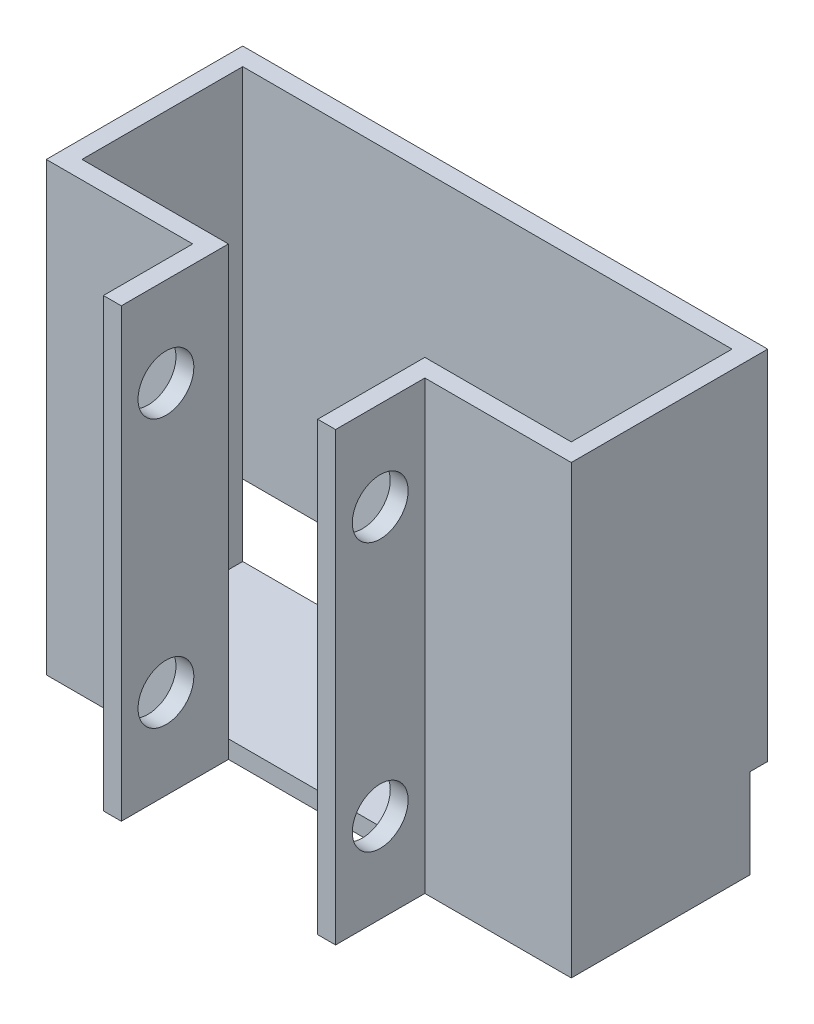
ISO-10303-21;
HEADER;
FILE_DESCRIPTION(('STEP AP214'),'2;1');
FILE_NAME('part.step','',(''),(''),'','','');
FILE_SCHEMA(('AUTOMOTIVE_DESIGN { 1 0 10303 214 1 1 1 1 }'));
ENDSEC;
DATA;
#1=APPLICATION_CONTEXT('core data for automotive mechanical design processes');
#2=APPLICATION_PROTOCOL_DEFINITION('international standard','automotive_design',2000,#1);
#3=PRODUCT_CONTEXT('',#1,'mechanical');
#4=PRODUCT('Part','Part','',(#3));
#5=PRODUCT_RELATED_PRODUCT_CATEGORY('part','',(#4));
#6=PRODUCT_DEFINITION_FORMATION('','',#4);
#7=PRODUCT_DEFINITION_CONTEXT('part definition',#1,'design');
#8=PRODUCT_DEFINITION('design','',#6,#7);
#9=PRODUCT_DEFINITION_SHAPE('','',#8);
#10=(LENGTH_UNIT() NAMED_UNIT(*) SI_UNIT(.MILLI.,.METRE.));
#11=(NAMED_UNIT(*) PLANE_ANGLE_UNIT() SI_UNIT($,.RADIAN.));
#12=(NAMED_UNIT(*) SI_UNIT($,.STERADIAN.) SOLID_ANGLE_UNIT());
#13=UNCERTAINTY_MEASURE_WITH_UNIT(LENGTH_MEASURE(1.E-05),#10,'distance_accuracy_value','');
#14=(GEOMETRIC_REPRESENTATION_CONTEXT(3) GLOBAL_UNCERTAINTY_ASSIGNED_CONTEXT((#13)) GLOBAL_UNIT_ASSIGNED_CONTEXT((#10,
#11,#12)) REPRESENTATION_CONTEXT('',''));
#15=CARTESIAN_POINT('',(0.,0.,0.));
#16=DIRECTION('',(0.,0.,1.));
#17=DIRECTION('',(1.,0.,0.));
#18=AXIS2_PLACEMENT_3D('',#15,#16,#17);
#19=CARTESIAN_POINT('',(0.,0.,27.94));
#20=DIRECTION('',(0.,0.,1.));
#21=DIRECTION('',(1.,0.,0.));
#22=AXIS2_PLACEMENT_3D('',#19,#20,#21);
#23=PLANE('',#22);
#24=DIRECTION('',(-1.,0.,0.));
#25=VECTOR('',#24,1.);
#26=CARTESIAN_POINT('',(-35.9935676045013,30.5475602803156,27.94));
#27=LINE('',#26,#25);
#28=CARTESIAN_POINT('',(38.6824323954987,30.5475602803156,27.94));
#29=VERTEX_POINT('',#28);
#30=CARTESIAN_POINT('',(17.8544323954987,30.5475602803156,27.94));
#31=VERTEX_POINT('',#30);
#32=EDGE_CURVE('E306',#29,#31,#27,.T.);
#33=ORIENTED_EDGE('',*,*,#32,.T.);
#34=DIRECTION('',(0.,1.,0.));
#35=VECTOR('',#34,1.);
#36=CARTESIAN_POINT('',(17.8544323954987,30.5475602803156,27.94));
#37=LINE('',#36,#35);
#38=CARTESIAN_POINT('',(17.8544323954987,-32.9524397196844,27.94));
#39=VERTEX_POINT('',#38);
#40=EDGE_CURVE('E196',#39,#31,#37,.T.);
#41=ORIENTED_EDGE('',*,*,#40,.F.);
#42=DIRECTION('',(1.,0.,0.));
#43=VECTOR('',#42,1.);
#44=CARTESIAN_POINT('',(-35.9935676045013,-32.9524397196844,27.94));
#45=LINE('',#44,#43);
#46=CARTESIAN_POINT('',(38.6824323954987,-32.9524397196844,27.94));
#47=VERTEX_POINT('',#46);
#48=EDGE_CURVE('E298',#39,#47,#45,.T.);
#49=ORIENTED_EDGE('',*,*,#48,.T.);
#50=DIRECTION('',(0.,1.,0.));
#51=VECTOR('',#50,1.);
#52=CARTESIAN_POINT('',(38.6824323954987,30.5475602803156,27.94));
#53=LINE('',#52,#51);
#54=EDGE_CURVE('E303',#47,#29,#53,.T.);
#55=ORIENTED_EDGE('',*,*,#54,.T.);
#56=EDGE_LOOP('',(#33,#41,#49,#55));
#57=FACE_BOUND('',#56,.T.);
#58=ADVANCED_FACE('F33',(#57),#23,.T.);
#59=CARTESIAN_POINT('',(-35.9935676045013,-32.9524397196844,27.94));
#60=VERTEX_POINT('',#59);
#61=CARTESIAN_POINT('',(-15.1655676045013,-32.9524397196844,27.94));
#62=VERTEX_POINT('',#61);
#63=EDGE_CURVE('E300',#60,#62,#45,.T.);
#64=ORIENTED_EDGE('',*,*,#63,.T.);
#65=DIRECTION('',(0.,-1.,0.));
#66=VECTOR('',#65,1.);
#67=CARTESIAN_POINT('',(-15.1655676045013,30.5475602803156,27.94));
#68=LINE('',#67,#66);
#69=CARTESIAN_POINT('',(-15.1655676045013,30.5475602803156,27.94));
#70=VERTEX_POINT('',#69);
#71=EDGE_CURVE('E209',#70,#62,#68,.T.);
#72=ORIENTED_EDGE('',*,*,#71,.F.);
#73=CARTESIAN_POINT('',(-35.9935676045013,30.5475602803156,27.94));
#74=VERTEX_POINT('',#73);
#75=EDGE_CURVE('E305',#70,#74,#27,.T.);
#76=ORIENTED_EDGE('',*,*,#75,.T.);
#77=DIRECTION('',(0.,-1.,0.));
#78=VECTOR('',#77,1.);
#79=CARTESIAN_POINT('',(-35.9935676045013,30.5475602803156,27.94));
#80=LINE('',#79,#78);
#81=EDGE_CURVE('E295',#74,#60,#80,.T.);
#82=ORIENTED_EDGE('',*,*,#81,.T.);
#83=EDGE_LOOP('',(#64,#72,#76,#82));
#84=FACE_BOUND('',#83,.T.);
#85=ADVANCED_FACE('F365',(#84),#23,.T.);
#86=CARTESIAN_POINT('',(36.1424323954987,-30.4124397196844,25.4));
#87=DIRECTION('',(0.,0.,1.));
#88=DIRECTION('',(1.,0.,0.));
#89=AXIS2_PLACEMENT_3D('',#86,#87,#88);
#90=PLANE('',#89);
#91=DIRECTION('',(1.,0.,0.));
#92=VECTOR('',#91,1.);
#93=CARTESIAN_POINT('',(36.1424323954987,30.5475602803156,25.4));
#94=LINE('',#93,#92);
#95=CARTESIAN_POINT('',(-33.4535676045013,30.5475602803156,25.4));
#96=VERTEX_POINT('',#95);
#97=CARTESIAN_POINT('',(-12.6255676045013,30.5475602803156,25.4));
#98=VERTEX_POINT('',#97);
#99=EDGE_CURVE('E260',#96,#98,#94,.T.);
#100=ORIENTED_EDGE('',*,*,#99,.T.);
#101=DIRECTION('',(0.,-1.,0.));
#102=VECTOR('',#101,1.);
#103=CARTESIAN_POINT('',(-12.6255676045013,30.5475602803156,25.4));
#104=LINE('',#103,#102);
#105=CARTESIAN_POINT('',(-12.6255676045013,-30.4124397196844,25.4));
#106=VERTEX_POINT('',#105);
#107=EDGE_CURVE('E244',#98,#106,#104,.T.);
#108=ORIENTED_EDGE('',*,*,#107,.T.);
#109=DIRECTION('',(1.,0.,0.));
#110=VECTOR('',#109,1.);
#111=CARTESIAN_POINT('',(36.1424323954987,-30.4124397196844,25.4));
#112=LINE('',#111,#110);
#113=CARTESIAN_POINT('',(-33.4535676045013,-30.4124397196844,25.4));
#114=VERTEX_POINT('',#113);
#115=EDGE_CURVE('E267',#114,#106,#112,.T.);
#116=ORIENTED_EDGE('',*,*,#115,.F.);
#117=DIRECTION('',(0.,1.,0.));
#118=VECTOR('',#117,1.);
#119=CARTESIAN_POINT('',(-33.4535676045013,-30.4124397196844,25.4));
#120=LINE('',#119,#118);
#121=EDGE_CURVE('E287',#114,#96,#120,.T.);
#122=ORIENTED_EDGE('',*,*,#121,.T.);
#123=EDGE_LOOP('',(#100,#108,#116,#122));
#124=FACE_BOUND('',#123,.T.);
#125=ADVANCED_FACE('F371',(#124),#90,.F.);
#126=CARTESIAN_POINT('',(-35.9935676045013,30.5475602803156,27.94));
#127=DIRECTION('',(1.,0.,0.));
#128=DIRECTION('',(0.,1.,0.));
#129=AXIS2_PLACEMENT_3D('',#126,#127,#128);
#130=PLANE('',#129);
#131=DIRECTION('',(0.,-1.,0.));
#132=VECTOR('',#131,1.);
#133=CARTESIAN_POINT('',(-35.9935676045013,30.5475602803156,0.));
#134=LINE('',#133,#132);
#135=CARTESIAN_POINT('',(-35.9935676045013,30.5475602803156,0.));
#136=VERTEX_POINT('',#135);
#137=CARTESIAN_POINT('',(-35.9935676045013,-20.2524397196844,0.));
#138=VERTEX_POINT('',#137);
#139=EDGE_CURVE('E286',#136,#138,#134,.T.);
#140=ORIENTED_EDGE('',*,*,#139,.T.);
#141=DIRECTION('',(0.,0.,-1.));
#142=VECTOR('',#141,1.);
#143=CARTESIAN_POINT('',(-35.9935676045013,-20.2524397196844,2.54));
#144=LINE('',#143,#142);
#145=CARTESIAN_POINT('',(-35.9935676045013,-20.2524397196844,2.54));
#146=VERTEX_POINT('',#145);
#147=EDGE_CURVE('E50',#146,#138,#144,.T.);
#148=ORIENTED_EDGE('',*,*,#147,.F.);
#149=DIRECTION('',(0.,1.,0.));
#150=VECTOR('',#149,1.);
#151=CARTESIAN_POINT('',(-35.9935676045013,-32.9524397196844,2.54));
#152=LINE('',#151,#150);
#153=CARTESIAN_POINT('',(-35.9935676045013,-32.9524397196844,2.54));
#154=VERTEX_POINT('',#153);
#155=EDGE_CURVE('E231',#154,#146,#152,.T.);
#156=ORIENTED_EDGE('',*,*,#155,.F.);
#157=DIRECTION('',(0.,0.,-1.));
#158=VECTOR('',#157,1.);
#159=CARTESIAN_POINT('',(-35.9935676045013,-32.9524397196844,27.94));
#160=LINE('',#159,#158);
#161=EDGE_CURVE('E11',#60,#154,#160,.T.);
#162=ORIENTED_EDGE('',*,*,#161,.F.);
#163=ORIENTED_EDGE('',*,*,#81,.F.);
#164=DIRECTION('',(0.,0.,-1.));
#165=VECTOR('',#164,1.);
#166=CARTESIAN_POINT('',(-35.9935676045013,30.5475602803156,27.94));
#167=LINE('',#166,#165);
#168=EDGE_CURVE('E309',#74,#136,#167,.T.);
#169=ORIENTED_EDGE('',*,*,#168,.T.);
#170=EDGE_LOOP('',(#140,#148,#156,#162,#163,#169));
#171=FACE_BOUND('',#170,.T.);
#172=ADVANCED_FACE('F35',(#171),#130,.F.);
#173=CARTESIAN_POINT('',(-35.9935676045013,-32.9524397196844,27.94));
#174=DIRECTION('',(0.,1.,0.));
#175=DIRECTION('',(0.,0.,1.));
#176=AXIS2_PLACEMENT_3D('',#173,#174,#175);
#177=PLANE('',#176);
#178=ORIENTED_EDGE('',*,*,#161,.T.);
#179=DIRECTION('',(-1.,0.,0.));
#180=VECTOR('',#179,1.);
#181=CARTESIAN_POINT('',(38.6824323954987,-32.9524397196844,2.54));
#182=LINE('',#181,#180);
#183=CARTESIAN_POINT('',(38.6824323954987,-32.9524397196844,2.54));
#184=VERTEX_POINT('',#183);
#185=EDGE_CURVE('E229',#184,#154,#182,.T.);
#186=ORIENTED_EDGE('',*,*,#185,.F.);
#187=DIRECTION('',(0.,0.,-1.));
#188=VECTOR('',#187,1.);
#189=CARTESIAN_POINT('',(38.6824323954987,-32.9524397196844,27.94));
#190=LINE('',#189,#188);
#191=EDGE_CURVE('E42',#47,#184,#190,.T.);
#192=ORIENTED_EDGE('',*,*,#191,.F.);
#193=ORIENTED_EDGE('',*,*,#48,.F.);
#194=DIRECTION('',(0.,0.,-1.));
#195=VECTOR('',#194,1.);
#196=CARTESIAN_POINT('',(17.8544323954987,-32.9524397196844,40.64));
#197=LINE('',#196,#195);
#198=CARTESIAN_POINT('',(17.8544323954987,-32.9524397196844,40.64));
#199=VERTEX_POINT('',#198);
#200=EDGE_CURVE('E187',#199,#39,#197,.T.);
#201=ORIENTED_EDGE('',*,*,#200,.F.);
#202=DIRECTION('',(1.,0.,0.));
#203=VECTOR('',#202,1.);
#204=CARTESIAN_POINT('',(15.3144323954987,-32.9524397196844,40.64));
#205=LINE('',#204,#203);
#206=CARTESIAN_POINT('',(15.3144323954987,-32.9524397196844,40.64));
#207=VERTEX_POINT('',#206);
#208=EDGE_CURVE('E184',#207,#199,#205,.T.);
#209=ORIENTED_EDGE('',*,*,#208,.F.);
#210=DIRECTION('',(0.,0.,1.));
#211=VECTOR('',#210,1.);
#212=CARTESIAN_POINT('',(15.3144323954987,-32.9524397196844,25.4));
#213=LINE('',#212,#211);
#214=CARTESIAN_POINT('',(15.3144323954987,-32.9524397196844,25.4));
#215=VERTEX_POINT('',#214);
#216=EDGE_CURVE('E173',#215,#207,#213,.T.);
#217=ORIENTED_EDGE('',*,*,#216,.F.);
#218=DIRECTION('',(1.,0.,0.));
#219=VECTOR('',#218,1.);
#220=CARTESIAN_POINT('',(-12.6255676045013,-32.9524397196844,25.4));
#221=LINE('',#220,#219);
#222=CARTESIAN_POINT('',(-12.6255676045013,-32.9524397196844,25.4));
#223=VERTEX_POINT('',#222);
#224=EDGE_CURVE('E247',#223,#215,#221,.T.);
#225=ORIENTED_EDGE('',*,*,#224,.F.);
#226=DIRECTION('',(0.,0.,1.));
#227=VECTOR('',#226,1.);
#228=CARTESIAN_POINT('',(-12.6255676045013,-32.9524397196844,25.4));
#229=LINE('',#228,#227);
#230=CARTESIAN_POINT('',(-12.6255676045013,-32.9524397196844,40.64));
#231=VERTEX_POINT('',#230);
#232=EDGE_CURVE('E181',#223,#231,#229,.T.);
#233=ORIENTED_EDGE('',*,*,#232,.T.);
#234=DIRECTION('',(1.,0.,0.));
#235=VECTOR('',#234,1.);
#236=CARTESIAN_POINT('',(-12.6255676045013,-32.9524397196844,40.64));
#237=LINE('',#236,#235);
#238=CARTESIAN_POINT('',(-15.1655676045013,-32.9524397196844,40.64));
#239=VERTEX_POINT('',#238);
#240=EDGE_CURVE('E217',#239,#231,#237,.T.);
#241=ORIENTED_EDGE('',*,*,#240,.F.);
#242=DIRECTION('',(0.,0.,-1.));
#243=VECTOR('',#242,1.);
#244=CARTESIAN_POINT('',(-15.1655676045013,-32.9524397196844,40.64));
#245=LINE('',#244,#243);
#246=EDGE_CURVE('E220',#239,#62,#245,.T.);
#247=ORIENTED_EDGE('',*,*,#246,.T.);
#248=ORIENTED_EDGE('',*,*,#63,.F.);
#249=EDGE_LOOP('',(#178,#186,#192,#193,#201,#209,#217,#225,#233,#241,#247,#248));
#250=FACE_BOUND('',#249,.T.);
#251=ADVANCED_FACE('F185',(#250),#177,.F.);
#252=CARTESIAN_POINT('',(38.6824323954987,30.5475602803156,27.94));
#253=DIRECTION('',(-1.,0.,0.));
#254=DIRECTION('',(0.,0.,1.));
#255=AXIS2_PLACEMENT_3D('',#252,#253,#254);
#256=PLANE('',#255);
#257=DIRECTION('',(0.,-1.,0.));
#258=VECTOR('',#257,1.);
#259=CARTESIAN_POINT('',(38.6824323954987,-32.9524397196844,2.54));
#260=LINE('',#259,#258);
#261=CARTESIAN_POINT('',(38.6824323954987,-20.2524397196844,2.54));
#262=VERTEX_POINT('',#261);
#263=EDGE_CURVE('E227',#262,#184,#260,.T.);
#264=ORIENTED_EDGE('',*,*,#263,.F.);
#265=DIRECTION('',(0.,0.,-1.));
#266=VECTOR('',#265,1.);
#267=CARTESIAN_POINT('',(38.6824323954987,-20.2524397196844,2.54));
#268=LINE('',#267,#266);
#269=CARTESIAN_POINT('',(38.6824323954987,-20.2524397196844,0.));
#270=VERTEX_POINT('',#269);
#271=EDGE_CURVE('E239',#262,#270,#268,.T.);
#272=ORIENTED_EDGE('',*,*,#271,.T.);
#273=DIRECTION('',(0.,1.,0.));
#274=VECTOR('',#273,1.);
#275=CARTESIAN_POINT('',(38.6824323954987,30.5475602803156,0.));
#276=LINE('',#275,#274);
#277=CARTESIAN_POINT('',(38.6824323954987,30.5475602803156,0.));
#278=VERTEX_POINT('',#277);
#279=EDGE_CURVE('E312',#270,#278,#276,.T.);
#280=ORIENTED_EDGE('',*,*,#279,.T.);
#281=DIRECTION('',(0.,0.,-1.));
#282=VECTOR('',#281,1.);
#283=CARTESIAN_POINT('',(38.6824323954987,30.5475602803156,27.94));
#284=LINE('',#283,#282);
#285=EDGE_CURVE('E317',#29,#278,#284,.T.);
#286=ORIENTED_EDGE('',*,*,#285,.F.);
#287=ORIENTED_EDGE('',*,*,#54,.F.);
#288=ORIENTED_EDGE('',*,*,#191,.T.);
#289=EDGE_LOOP('',(#264,#272,#280,#286,#287,#288));
#290=FACE_BOUND('',#289,.T.);
#291=ADVANCED_FACE('F384',(#290),#256,.F.);
#292=CARTESIAN_POINT('',(-35.9935676045013,30.5475602803156,27.94));
#293=DIRECTION('',(0.,-1.,0.));
#294=DIRECTION('',(0.,0.,-1.));
#295=AXIS2_PLACEMENT_3D('',#292,#293,#294);
#296=PLANE('',#295);
#297=ORIENTED_EDGE('',*,*,#75,.F.);
#298=DIRECTION('',(0.,0.,-1.));
#299=VECTOR('',#298,1.);
#300=CARTESIAN_POINT('',(-15.1655676045013,30.5475602803156,40.64));
#301=LINE('',#300,#299);
#302=CARTESIAN_POINT('',(-15.1655676045013,30.5475602803156,40.64));
#303=VERTEX_POINT('',#302);
#304=EDGE_CURVE('E224',#303,#70,#301,.T.);
#305=ORIENTED_EDGE('',*,*,#304,.F.);
#306=DIRECTION('',(-1.,0.,0.));
#307=VECTOR('',#306,1.);
#308=CARTESIAN_POINT('',(-12.6255676045013,30.5475602803156,40.64));
#309=LINE('',#308,#307);
#310=CARTESIAN_POINT('',(-12.6255676045013,30.5475602803156,40.64));
#311=VERTEX_POINT('',#310);
#312=EDGE_CURVE('E213',#311,#303,#309,.T.);
#313=ORIENTED_EDGE('',*,*,#312,.F.);
#314=DIRECTION('',(0.,0.,1.));
#315=VECTOR('',#314,1.);
#316=CARTESIAN_POINT('',(-12.6255676045013,30.5475602803156,25.4));
#317=LINE('',#316,#315);
#318=EDGE_CURVE('E251',#98,#311,#317,.T.);
#319=ORIENTED_EDGE('',*,*,#318,.F.);
#320=ORIENTED_EDGE('',*,*,#99,.F.);
#321=DIRECTION('',(0.,0.,1.));
#322=VECTOR('',#321,1.);
#323=CARTESIAN_POINT('',(-33.4535676045013,30.5475602803156,25.4));
#324=LINE('',#323,#322);
#325=CARTESIAN_POINT('',(-33.4535676045013,30.5475602803156,2.54000000000001));
#326=VERTEX_POINT('',#325);
#327=EDGE_CURVE('E277',#326,#96,#324,.T.);
#328=ORIENTED_EDGE('',*,*,#327,.F.);
#329=DIRECTION('',(-1.,0.,0.));
#330=VECTOR('',#329,1.);
#331=CARTESIAN_POINT('',(36.1424323954987,30.5475602803156,2.54));
#332=LINE('',#331,#330);
#333=CARTESIAN_POINT('',(36.1424323954987,30.5475602803156,2.54));
#334=VERTEX_POINT('',#333);
#335=EDGE_CURVE('E274',#334,#326,#332,.T.);
#336=ORIENTED_EDGE('',*,*,#335,.F.);
#337=DIRECTION('',(0.,0.,-1.));
#338=VECTOR('',#337,1.);
#339=CARTESIAN_POINT('',(36.1424323954987,30.5475602803156,25.4));
#340=LINE('',#339,#338);
#341=CARTESIAN_POINT('',(36.1424323954987,30.5475602803156,25.4));
#342=VERTEX_POINT('',#341);
#343=EDGE_CURVE('E253',#342,#334,#340,.T.);
#344=ORIENTED_EDGE('',*,*,#343,.F.);
#345=CARTESIAN_POINT('',(15.3144323954987,30.5475602803156,25.4));
#346=VERTEX_POINT('',#345);
#347=EDGE_CURVE('E280',#346,#342,#94,.T.);
#348=ORIENTED_EDGE('',*,*,#347,.F.);
#349=DIRECTION('',(0.,0.,1.));
#350=VECTOR('',#349,1.);
#351=CARTESIAN_POINT('',(15.3144323954987,30.5475602803156,25.4));
#352=LINE('',#351,#350);
#353=CARTESIAN_POINT('',(15.3144323954987,30.5475602803156,40.64));
#354=VERTEX_POINT('',#353);
#355=EDGE_CURVE('E180',#346,#354,#352,.T.);
#356=ORIENTED_EDGE('',*,*,#355,.T.);
#357=DIRECTION('',(-1.,0.,0.));
#358=VECTOR('',#357,1.);
#359=CARTESIAN_POINT('',(15.3144323954987,30.5475602803156,40.64));
#360=LINE('',#359,#358);
#361=CARTESIAN_POINT('',(17.8544323954987,30.5475602803156,40.64));
#362=VERTEX_POINT('',#361);
#363=EDGE_CURVE('E195',#362,#354,#360,.T.);
#364=ORIENTED_EDGE('',*,*,#363,.F.);
#365=DIRECTION('',(0.,0.,-1.));
#366=VECTOR('',#365,1.);
#367=CARTESIAN_POINT('',(17.8544323954987,30.5475602803156,40.64));
#368=LINE('',#367,#366);
#369=EDGE_CURVE('E204',#362,#31,#368,.T.);
#370=ORIENTED_EDGE('',*,*,#369,.T.);
#371=ORIENTED_EDGE('',*,*,#32,.F.);
#372=ORIENTED_EDGE('',*,*,#285,.T.);
#373=DIRECTION('',(-1.,0.,0.));
#374=VECTOR('',#373,1.);
#375=CARTESIAN_POINT('',(-35.9935676045013,30.5475602803156,0.));
#376=LINE('',#375,#374);
#377=EDGE_CURVE('E299',#278,#136,#376,.T.);
#378=ORIENTED_EDGE('',*,*,#377,.T.);
#379=ORIENTED_EDGE('',*,*,#168,.F.);
#380=EDGE_LOOP('',(#297,#305,#313,#319,#320,#328,#336,#344,#348,#356,#364,#370,#371,#372,#378,#379));
#381=FACE_BOUND('',#380,.T.);
#382=ADVANCED_FACE('F380',(#381),#296,.F.);
#383=CARTESIAN_POINT('',(0.,0.,0.));
#384=DIRECTION('',(0.,0.,1.));
#385=DIRECTION('',(1.,0.,0.));
#386=AXIS2_PLACEMENT_3D('',#383,#384,#385);
#387=PLANE('',#386);
#388=ORIENTED_EDGE('',*,*,#279,.F.);
#389=DIRECTION('',(1.,0.,0.));
#390=VECTOR('',#389,1.);
#391=CARTESIAN_POINT('',(38.6824323954987,-20.2524397196844,0.));
#392=LINE('',#391,#390);
#393=EDGE_CURVE('E226',#138,#270,#392,.T.);
#394=ORIENTED_EDGE('',*,*,#393,.F.);
#395=ORIENTED_EDGE('',*,*,#139,.F.);
#396=ORIENTED_EDGE('',*,*,#377,.F.);
#397=EDGE_LOOP('',(#388,#394,#395,#396));
#398=FACE_BOUND('',#397,.T.);
#399=ADVANCED_FACE('F377',(#398),#387,.F.);
#400=CARTESIAN_POINT('',(36.1424323954987,-30.4124397196844,25.4));
#401=DIRECTION('',(1.,0.,0.));
#402=DIRECTION('',(0.,0.,-1.));
#403=AXIS2_PLACEMENT_3D('',#400,#401,#402);
#404=PLANE('',#403);
#405=ORIENTED_EDGE('',*,*,#343,.T.);
#406=DIRECTION('',(0.,1.,0.));
#407=VECTOR('',#406,1.);
#408=CARTESIAN_POINT('',(36.1424323954987,-30.4124397196844,2.54));
#409=LINE('',#408,#407);
#410=CARTESIAN_POINT('',(36.1424323954987,-20.2524397196844,2.54));
#411=VERTEX_POINT('',#410);
#412=EDGE_CURVE('E270',#411,#334,#409,.T.);
#413=ORIENTED_EDGE('',*,*,#412,.F.);
#414=CARTESIAN_POINT('',(36.1424323954987,-30.4124397196844,2.54));
#415=VERTEX_POINT('',#414);
#416=EDGE_CURVE('E293',#415,#411,#409,.T.);
#417=ORIENTED_EDGE('',*,*,#416,.F.);
#418=DIRECTION('',(0.,0.,-1.));
#419=VECTOR('',#418,1.);
#420=CARTESIAN_POINT('',(36.1424323954987,-30.4124397196844,25.4));
#421=LINE('',#420,#419);
#422=CARTESIAN_POINT('',(36.1424323954987,-30.4124397196844,25.4));
#423=VERTEX_POINT('',#422);
#424=EDGE_CURVE('E256',#423,#415,#421,.T.);
#425=ORIENTED_EDGE('',*,*,#424,.F.);
#426=DIRECTION('',(0.,1.,0.));
#427=VECTOR('',#426,1.);
#428=CARTESIAN_POINT('',(36.1424323954987,-30.4124397196844,25.4));
#429=LINE('',#428,#427);
#430=EDGE_CURVE('E283',#423,#342,#429,.T.);
#431=ORIENTED_EDGE('',*,*,#430,.T.);
#432=EDGE_LOOP('',(#405,#413,#417,#425,#431));
#433=FACE_BOUND('',#432,.T.);
#434=ADVANCED_FACE('F375',(#433),#404,.F.);
#435=CARTESIAN_POINT('',(15.3144323954987,-30.4124397196844,25.4));
#436=VERTEX_POINT('',#435);
#437=EDGE_CURVE('E266',#436,#423,#112,.T.);
#438=ORIENTED_EDGE('',*,*,#437,.F.);
#439=DIRECTION('',(0.,1.,0.));
#440=VECTOR('',#439,1.);
#441=CARTESIAN_POINT('',(15.3144323954987,30.5475602803156,25.4));
#442=LINE('',#441,#440);
#443=EDGE_CURVE('E249',#436,#346,#442,.T.);
#444=ORIENTED_EDGE('',*,*,#443,.T.);
#445=ORIENTED_EDGE('',*,*,#347,.T.);
#446=ORIENTED_EDGE('',*,*,#430,.F.);
#447=EDGE_LOOP('',(#438,#444,#445,#446));
#448=FACE_BOUND('',#447,.T.);
#449=ADVANCED_FACE('F398',(#448),#90,.F.);
#450=CARTESIAN_POINT('',(-33.4535676045013,-30.4124397196844,25.4));
#451=DIRECTION('',(-1.,0.,0.));
#452=DIRECTION('',(0.,0.,1.));
#453=AXIS2_PLACEMENT_3D('',#450,#451,#452);
#454=PLANE('',#453);
#455=ORIENTED_EDGE('',*,*,#327,.T.);
#456=ORIENTED_EDGE('',*,*,#121,.F.);
#457=DIRECTION('',(0.,0.,1.));
#458=VECTOR('',#457,1.);
#459=CARTESIAN_POINT('',(-33.4535676045013,-30.4124397196844,25.4));
#460=LINE('',#459,#458);
#461=CARTESIAN_POINT('',(-33.4535676045013,-30.4124397196844,2.54000000000001));
#462=VERTEX_POINT('',#461);
#463=EDGE_CURVE('E263',#462,#114,#460,.T.);
#464=ORIENTED_EDGE('',*,*,#463,.F.);
#465=DIRECTION('',(0.,1.,0.));
#466=VECTOR('',#465,1.);
#467=CARTESIAN_POINT('',(-33.4535676045013,-30.4124397196844,2.54000000000001));
#468=LINE('',#467,#466);
#469=CARTESIAN_POINT('',(-33.4535676045013,-20.2524397196844,2.54));
#470=VERTEX_POINT('',#469);
#471=EDGE_CURVE('E289',#462,#470,#468,.T.);
#472=ORIENTED_EDGE('',*,*,#471,.T.);
#473=EDGE_CURVE('E292',#470,#326,#468,.T.);
#474=ORIENTED_EDGE('',*,*,#473,.T.);
#475=EDGE_LOOP('',(#455,#456,#464,#472,#474));
#476=FACE_BOUND('',#475,.T.);
#477=ADVANCED_FACE('F433',(#476),#454,.F.);
#478=CARTESIAN_POINT('',(36.1424323954987,-30.4124397196844,2.54));
#479=DIRECTION('',(0.,0.,-1.));
#480=DIRECTION('',(-1.,0.,0.));
#481=AXIS2_PLACEMENT_3D('',#478,#479,#480);
#482=PLANE('',#481);
#483=ORIENTED_EDGE('',*,*,#473,.F.);
#484=DIRECTION('',(1.,0.,0.));
#485=VECTOR('',#484,1.);
#486=CARTESIAN_POINT('',(38.6824323954987,-20.2524397196844,2.54));
#487=LINE('',#486,#485);
#488=EDGE_CURVE('E237',#470,#411,#487,.T.);
#489=ORIENTED_EDGE('',*,*,#488,.T.);
#490=ORIENTED_EDGE('',*,*,#412,.T.);
#491=ORIENTED_EDGE('',*,*,#335,.T.);
#492=EDGE_LOOP('',(#483,#489,#490,#491));
#493=FACE_BOUND('',#492,.T.);
#494=ADVANCED_FACE('F420',(#493),#482,.F.);
#495=CARTESIAN_POINT('',(0.,-30.4124397196844,0.));
#496=DIRECTION('',(0.,1.,0.));
#497=DIRECTION('',(0.,0.,1.));
#498=AXIS2_PLACEMENT_3D('',#495,#496,#497);
#499=PLANE('',#498);
#500=ORIENTED_EDGE('',*,*,#424,.T.);
#501=DIRECTION('',(-1.,0.,0.));
#502=VECTOR('',#501,1.);
#503=CARTESIAN_POINT('',(36.1424323954987,-30.4124397196844,2.54));
#504=LINE('',#503,#502);
#505=EDGE_CURVE('E259',#415,#462,#504,.T.);
#506=ORIENTED_EDGE('',*,*,#505,.T.);
#507=ORIENTED_EDGE('',*,*,#463,.T.);
#508=ORIENTED_EDGE('',*,*,#115,.T.);
#509=EDGE_CURVE('E271',#106,#436,#112,.T.);
#510=ORIENTED_EDGE('',*,*,#509,.T.);
#511=ORIENTED_EDGE('',*,*,#437,.T.);
#512=EDGE_LOOP('',(#500,#506,#507,#508,#510,#511));
#513=FACE_BOUND('',#512,.T.);
#514=ADVANCED_FACE('F436',(#513),#499,.T.);
#515=CARTESIAN_POINT('',(-12.6255676045013,30.5475602803156,25.4));
#516=DIRECTION('',(-1.,0.,0.));
#517=DIRECTION('',(0.,-1.,0.));
#518=AXIS2_PLACEMENT_3D('',#515,#516,#517);
#519=PLANE('',#518);
#520=CARTESIAN_POINT('',(-12.6255676045013,17.8475602803156,34.29));
#521=DIRECTION('',(-1.,0.,0.));
#522=DIRECTION('',(0.,-1.,0.));
#523=AXIS2_PLACEMENT_3D('',#520,#521,#522);
#524=CIRCLE('',#523,3.96875);
#525=CARTESIAN_POINT('',(-12.6255676045013,13.8788102803156,34.29));
#526=VERTEX_POINT('',#525);
#527=EDGE_CURVE('E198',#526,#526,#524,.T.);
#528=ORIENTED_EDGE('',*,*,#527,.T.);
#529=EDGE_LOOP('',(#528));
#530=FACE_BOUND('',#529,.T.);
#531=CARTESIAN_POINT('',(-12.6255676045013,-20.2524397196844,34.29));
#532=DIRECTION('',(-1.,0.,0.));
#533=DIRECTION('',(0.,-1.,0.));
#534=AXIS2_PLACEMENT_3D('',#531,#532,#533);
#535=CIRCLE('',#534,3.96875);
#536=CARTESIAN_POINT('',(-12.6255676045013,-24.2211897196844,34.29));
#537=VERTEX_POINT('',#536);
#538=EDGE_CURVE('E328',#537,#537,#535,.T.);
#539=ORIENTED_EDGE('',*,*,#538,.T.);
#540=EDGE_LOOP('',(#539));
#541=FACE_BOUND('',#540,.T.);
#542=ORIENTED_EDGE('',*,*,#318,.T.);
#543=DIRECTION('',(0.,1.,0.));
#544=VECTOR('',#543,1.);
#545=CARTESIAN_POINT('',(-12.6255676045013,30.5475602803156,40.64));
#546=LINE('',#545,#544);
#547=EDGE_CURVE('E210',#231,#311,#546,.T.);
#548=ORIENTED_EDGE('',*,*,#547,.F.);
#549=ORIENTED_EDGE('',*,*,#232,.F.);
#550=EDGE_CURVE('E242',#106,#223,#104,.T.);
#551=ORIENTED_EDGE('',*,*,#550,.F.);
#552=ORIENTED_EDGE('',*,*,#107,.F.);
#553=EDGE_LOOP('',(#542,#548,#549,#551,#552));
#554=FACE_BOUND('',#553,.T.);
#555=ADVANCED_FACE('F459',(#530,#541,#554),#519,.F.);
#556=CARTESIAN_POINT('',(15.3144323954987,30.5475602803156,25.4));
#557=DIRECTION('',(1.,0.,0.));
#558=DIRECTION('',(0.,1.,0.));
#559=AXIS2_PLACEMENT_3D('',#556,#557,#558);
#560=PLANE('',#559);
#561=CARTESIAN_POINT('',(15.3144323954987,17.8475602803156,34.29));
#562=DIRECTION('',(1.,0.,0.));
#563=DIRECTION('',(0.,1.,0.));
#564=AXIS2_PLACEMENT_3D('',#561,#562,#563);
#565=CIRCLE('',#564,3.96875);
#566=CARTESIAN_POINT('',(15.3144323954987,21.8163102803156,34.29));
#567=VERTEX_POINT('',#566);
#568=EDGE_CURVE('E339',#567,#567,#565,.T.);
#569=ORIENTED_EDGE('',*,*,#568,.T.);
#570=EDGE_LOOP('',(#569));
#571=FACE_BOUND('',#570,.T.);
#572=CARTESIAN_POINT('',(15.3144323954987,-20.2524397196844,34.29));
#573=DIRECTION('',(1.,0.,0.));
#574=DIRECTION('',(0.,1.,0.));
#575=AXIS2_PLACEMENT_3D('',#572,#573,#574);
#576=CIRCLE('',#575,3.96875);
#577=CARTESIAN_POINT('',(15.3144323954987,-16.2836897196844,34.29));
#578=VERTEX_POINT('',#577);
#579=EDGE_CURVE('E323',#578,#578,#576,.T.);
#580=ORIENTED_EDGE('',*,*,#579,.T.);
#581=EDGE_LOOP('',(#580));
#582=FACE_BOUND('',#581,.T.);
#583=ORIENTED_EDGE('',*,*,#216,.T.);
#584=DIRECTION('',(0.,-1.,0.));
#585=VECTOR('',#584,1.);
#586=CARTESIAN_POINT('',(15.3144323954987,30.5475602803156,40.64));
#587=LINE('',#586,#585);
#588=EDGE_CURVE('E177',#354,#207,#587,.T.);
#589=ORIENTED_EDGE('',*,*,#588,.F.);
#590=ORIENTED_EDGE('',*,*,#355,.F.);
#591=ORIENTED_EDGE('',*,*,#443,.F.);
#592=EDGE_CURVE('E58',#215,#436,#442,.T.);
#593=ORIENTED_EDGE('',*,*,#592,.F.);
#594=EDGE_LOOP('',(#583,#589,#590,#591,#593));
#595=FACE_BOUND('',#594,.T.);
#596=ADVANCED_FACE('F175',(#571,#582,#595),#560,.F.);
#597=CARTESIAN_POINT('',(0.,0.,25.4));
#598=DIRECTION('',(0.,0.,1.));
#599=DIRECTION('',(1.,0.,0.));
#600=AXIS2_PLACEMENT_3D('',#597,#598,#599);
#601=PLANE('',#600);
#602=ORIENTED_EDGE('',*,*,#550,.T.);
#603=ORIENTED_EDGE('',*,*,#224,.T.);
#604=ORIENTED_EDGE('',*,*,#592,.T.);
#605=ORIENTED_EDGE('',*,*,#509,.F.);
#606=EDGE_LOOP('',(#602,#603,#604,#605));
#607=FACE_BOUND('',#606,.T.);
#608=ADVANCED_FACE('F461',(#607),#601,.T.);
#609=CARTESIAN_POINT('',(0.,0.,2.54));
#610=DIRECTION('',(0.,0.,1.));
#611=DIRECTION('',(1.,0.,0.));
#612=AXIS2_PLACEMENT_3D('',#609,#610,#611);
#613=PLANE('',#612);
#614=EDGE_CURVE('E233',#411,#262,#487,.T.);
#615=ORIENTED_EDGE('',*,*,#614,.T.);
#616=ORIENTED_EDGE('',*,*,#263,.T.);
#617=ORIENTED_EDGE('',*,*,#185,.T.);
#618=ORIENTED_EDGE('',*,*,#155,.T.);
#619=EDGE_CURVE('E234',#146,#470,#487,.T.);
#620=ORIENTED_EDGE('',*,*,#619,.T.);
#621=ORIENTED_EDGE('',*,*,#471,.F.);
#622=ORIENTED_EDGE('',*,*,#505,.F.);
#623=ORIENTED_EDGE('',*,*,#416,.T.);
#624=EDGE_LOOP('',(#615,#616,#617,#618,#620,#621,#622,#623));
#625=FACE_BOUND('',#624,.T.);
#626=ADVANCED_FACE('F414',(#625),#613,.F.);
#627=CARTESIAN_POINT('',(38.6824323954987,-20.2524397196844,2.54));
#628=DIRECTION('',(0.,1.,0.));
#629=DIRECTION('',(-1.,0.,0.));
#630=AXIS2_PLACEMENT_3D('',#627,#628,#629);
#631=PLANE('',#630);
#632=ORIENTED_EDGE('',*,*,#393,.T.);
#633=ORIENTED_EDGE('',*,*,#271,.F.);
#634=ORIENTED_EDGE('',*,*,#614,.F.);
#635=ORIENTED_EDGE('',*,*,#488,.F.);
#636=ORIENTED_EDGE('',*,*,#619,.F.);
#637=ORIENTED_EDGE('',*,*,#147,.T.);
#638=EDGE_LOOP('',(#632,#633,#634,#635,#636,#637));
#639=FACE_BOUND('',#638,.T.);
#640=ADVANCED_FACE('F406',(#639),#631,.F.);
#641=CARTESIAN_POINT('',(-15.1655676045013,30.5475602803156,40.64));
#642=DIRECTION('',(1.,0.,0.));
#643=DIRECTION('',(0.,1.,0.));
#644=AXIS2_PLACEMENT_3D('',#641,#642,#643);
#645=PLANE('',#644);
#646=CARTESIAN_POINT('',(-15.1655676045013,17.8475602803156,34.29));
#647=DIRECTION('',(-1.,0.,0.));
#648=DIRECTION('',(0.,-1.,0.));
#649=AXIS2_PLACEMENT_3D('',#646,#647,#648);
#650=CIRCLE('',#649,3.96875);
#651=CARTESIAN_POINT('',(-15.1655676045013,13.8788102803156,34.29));
#652=VERTEX_POINT('',#651);
#653=EDGE_CURVE('E324',#652,#652,#650,.T.);
#654=ORIENTED_EDGE('',*,*,#653,.F.);
#655=EDGE_LOOP('',(#654));
#656=FACE_BOUND('',#655,.T.);
#657=CARTESIAN_POINT('',(-15.1655676045013,-20.2524397196844,34.29));
#658=DIRECTION('',(-1.,0.,0.));
#659=DIRECTION('',(0.,-1.,0.));
#660=AXIS2_PLACEMENT_3D('',#657,#658,#659);
#661=CIRCLE('',#660,3.96875);
#662=CARTESIAN_POINT('',(-15.1655676045013,-24.2211897196844,34.29));
#663=VERTEX_POINT('',#662);
#664=EDGE_CURVE('E331',#663,#663,#661,.T.);
#665=ORIENTED_EDGE('',*,*,#664,.F.);
#666=EDGE_LOOP('',(#665));
#667=FACE_BOUND('',#666,.T.);
#668=ORIENTED_EDGE('',*,*,#71,.T.);
#669=ORIENTED_EDGE('',*,*,#246,.F.);
#670=DIRECTION('',(0.,-1.,0.));
#671=VECTOR('',#670,1.);
#672=CARTESIAN_POINT('',(-15.1655676045013,30.5475602803156,40.64));
#673=LINE('',#672,#671);
#674=EDGE_CURVE('E215',#303,#239,#673,.T.);
#675=ORIENTED_EDGE('',*,*,#674,.F.);
#676=ORIENTED_EDGE('',*,*,#304,.T.);
#677=EDGE_LOOP('',(#668,#669,#675,#676));
#678=FACE_BOUND('',#677,.T.);
#679=ADVANCED_FACE('F452',(#656,#667,#678),#645,.F.);
#680=CARTESIAN_POINT('',(0.,0.,40.64));
#681=DIRECTION('',(0.,0.,-1.));
#682=DIRECTION('',(-1.,0.,0.));
#683=AXIS2_PLACEMENT_3D('',#680,#681,#682);
#684=PLANE('',#683);
#685=ORIENTED_EDGE('',*,*,#547,.T.);
#686=ORIENTED_EDGE('',*,*,#312,.T.);
#687=ORIENTED_EDGE('',*,*,#674,.T.);
#688=ORIENTED_EDGE('',*,*,#240,.T.);
#689=EDGE_LOOP('',(#685,#686,#687,#688));
#690=FACE_BOUND('',#689,.T.);
#691=ADVANCED_FACE('F457',(#690),#684,.F.);
#692=CARTESIAN_POINT('',(17.8544323954987,30.5475602803156,40.64));
#693=DIRECTION('',(-1.,0.,0.));
#694=DIRECTION('',(0.,-1.,0.));
#695=AXIS2_PLACEMENT_3D('',#692,#693,#694);
#696=PLANE('',#695);
#697=CARTESIAN_POINT('',(17.8544323954987,17.8475602803156,34.29));
#698=DIRECTION('',(-1.,0.,0.));
#699=DIRECTION('',(0.,-1.,0.));
#700=AXIS2_PLACEMENT_3D('',#697,#698,#699);
#701=CIRCLE('',#700,3.96875);
#702=CARTESIAN_POINT('',(17.8544323954987,13.8788102803156,34.29));
#703=VERTEX_POINT('',#702);
#704=EDGE_CURVE('E37',#703,#703,#701,.T.);
#705=ORIENTED_EDGE('',*,*,#704,.T.);
#706=EDGE_LOOP('',(#705));
#707=FACE_BOUND('',#706,.T.);
#708=CARTESIAN_POINT('',(17.8544323954987,-20.2524397196844,34.29));
#709=DIRECTION('',(-1.,0.,0.));
#710=DIRECTION('',(0.,-1.,0.));
#711=AXIS2_PLACEMENT_3D('',#708,#709,#710);
#712=CIRCLE('',#711,3.96875);
#713=CARTESIAN_POINT('',(17.8544323954987,-24.2211897196844,34.29));
#714=VERTEX_POINT('',#713);
#715=EDGE_CURVE('E321',#714,#714,#712,.T.);
#716=ORIENTED_EDGE('',*,*,#715,.T.);
#717=EDGE_LOOP('',(#716));
#718=FACE_BOUND('',#717,.T.);
#719=ORIENTED_EDGE('',*,*,#40,.T.);
#720=ORIENTED_EDGE('',*,*,#369,.F.);
#721=DIRECTION('',(0.,1.,0.));
#722=VECTOR('',#721,1.);
#723=CARTESIAN_POINT('',(17.8544323954987,30.5475602803156,40.64));
#724=LINE('',#723,#722);
#725=EDGE_CURVE('E190',#199,#362,#724,.T.);
#726=ORIENTED_EDGE('',*,*,#725,.F.);
#727=ORIENTED_EDGE('',*,*,#200,.T.);
#728=EDGE_LOOP('',(#719,#720,#726,#727));
#729=FACE_BOUND('',#728,.T.);
#730=ADVANCED_FACE('F347',(#707,#718,#729),#696,.F.);
#731=CARTESIAN_POINT('',(0.,0.,40.64));
#732=DIRECTION('',(0.,0.,1.));
#733=DIRECTION('',(1.,0.,0.));
#734=AXIS2_PLACEMENT_3D('',#731,#732,#733);
#735=PLANE('',#734);
#736=ORIENTED_EDGE('',*,*,#588,.T.);
#737=ORIENTED_EDGE('',*,*,#208,.T.);
#738=ORIENTED_EDGE('',*,*,#725,.T.);
#739=ORIENTED_EDGE('',*,*,#363,.T.);
#740=EDGE_LOOP('',(#736,#737,#738,#739));
#741=FACE_BOUND('',#740,.T.);
#742=ADVANCED_FACE('F193',(#741),#735,.T.);
#743=CARTESIAN_POINT('',(35.6344323954987,-20.2524397196844,34.29));
#744=DIRECTION('',(-1.,0.,0.));
#745=DIRECTION('',(0.,-1.,0.));
#746=AXIS2_PLACEMENT_3D('',#743,#744,#745);
#747=CYLINDRICAL_SURFACE('',#746,3.96875);
#748=ORIENTED_EDGE('',*,*,#715,.F.);
#749=EDGE_LOOP('',(#748));
#750=FACE_BOUND('',#749,.T.);
#751=ORIENTED_EDGE('',*,*,#579,.F.);
#752=EDGE_LOOP('',(#751));
#753=FACE_BOUND('',#752,.T.);
#754=ADVANCED_FACE('F353',(#750,#753),#747,.F.);
#755=CARTESIAN_POINT('',(35.6344323954987,17.8475602803156,34.29));
#756=DIRECTION('',(-1.,0.,0.));
#757=DIRECTION('',(0.,-1.,0.));
#758=AXIS2_PLACEMENT_3D('',#755,#756,#757);
#759=CYLINDRICAL_SURFACE('',#758,3.96875);
#760=ORIENTED_EDGE('',*,*,#704,.F.);
#761=EDGE_LOOP('',(#760));
#762=FACE_BOUND('',#761,.T.);
#763=ORIENTED_EDGE('',*,*,#568,.F.);
#764=EDGE_LOOP('',(#763));
#765=FACE_BOUND('',#764,.T.);
#766=ADVANCED_FACE('F349',(#762,#765),#759,.F.);
#767=ORIENTED_EDGE('',*,*,#664,.T.);
#768=EDGE_LOOP('',(#767));
#769=FACE_BOUND('',#768,.T.);
#770=ORIENTED_EDGE('',*,*,#538,.F.);
#771=EDGE_LOOP('',(#770));
#772=FACE_BOUND('',#771,.T.);
#773=ADVANCED_FACE('F352',(#769,#772),#747,.F.);
#774=ORIENTED_EDGE('',*,*,#653,.T.);
#775=EDGE_LOOP('',(#774));
#776=FACE_BOUND('',#775,.T.);
#777=ORIENTED_EDGE('',*,*,#527,.F.);
#778=EDGE_LOOP('',(#777));
#779=FACE_BOUND('',#778,.T.);
#780=ADVANCED_FACE('F355',(#776,#779),#759,.F.);
#781=CLOSED_SHELL('',(#58,#85,#125,#172,#251,#291,#382,#399,#434,#449,#477,#494,#514,#555,#596,
#608,#626,#640,#679,#691,#730,#742,#754,#766,#773,#780));
#782=MANIFOLD_SOLID_BREP('B2',#781);
#783=ADVANCED_BREP_SHAPE_REPRESENTATION('',(#18,#782),#14);
#784=SHAPE_DEFINITION_REPRESENTATION(#9,#783);
ENDSEC;
END-ISO-10303-21;
